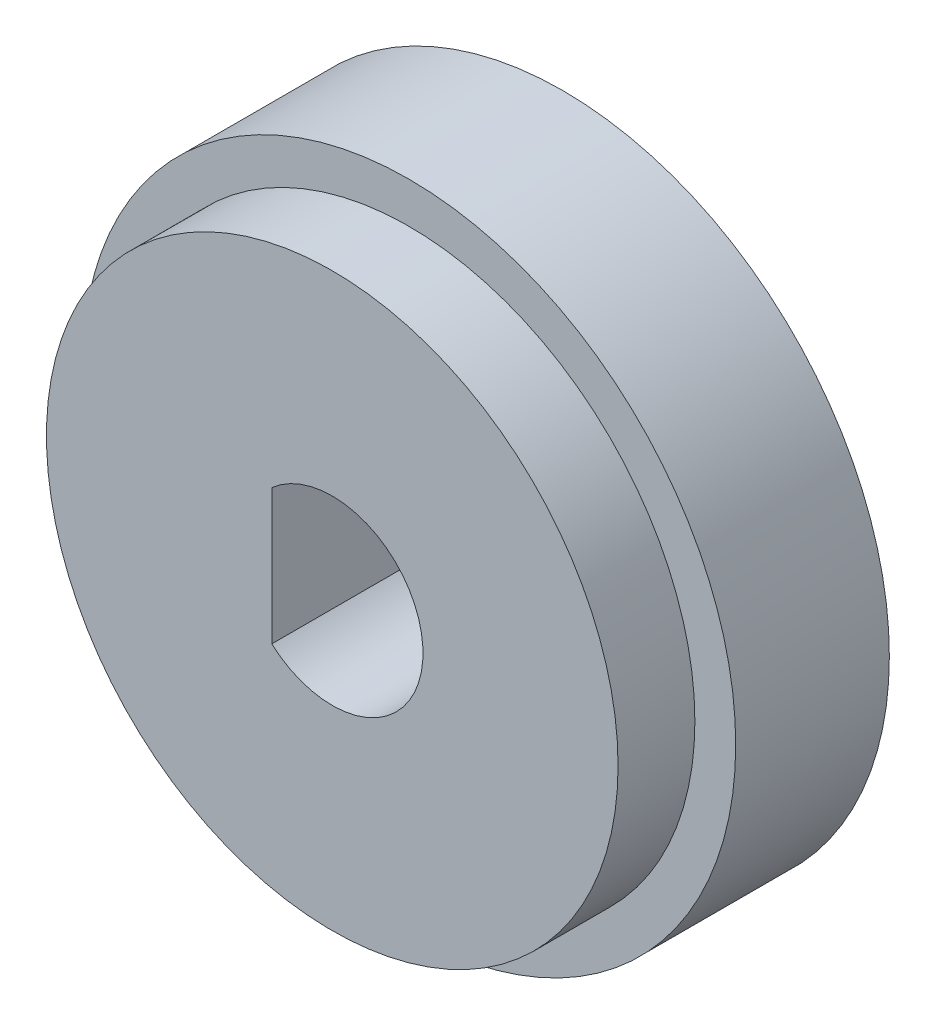
ISO-10303-21;
HEADER;
FILE_DESCRIPTION(('STEP AP214'),'2;1');
FILE_NAME('part.step','',(''),(''),'','','');
FILE_SCHEMA(('AUTOMOTIVE_DESIGN { 1 0 10303 214 1 1 1 1 }'));
ENDSEC;
DATA;
#1=APPLICATION_CONTEXT('core data for automotive mechanical design processes');
#2=APPLICATION_PROTOCOL_DEFINITION('international standard','automotive_design',2000,#1);
#3=PRODUCT_CONTEXT('',#1,'mechanical');
#4=PRODUCT('Part','Part','',(#3));
#5=PRODUCT_RELATED_PRODUCT_CATEGORY('part','',(#4));
#6=PRODUCT_DEFINITION_FORMATION('','',#4);
#7=PRODUCT_DEFINITION_CONTEXT('part definition',#1,'design');
#8=PRODUCT_DEFINITION('design','',#6,#7);
#9=PRODUCT_DEFINITION_SHAPE('','',#8);
#10=(LENGTH_UNIT() NAMED_UNIT(*) SI_UNIT(.MILLI.,.METRE.));
#11=(NAMED_UNIT(*) PLANE_ANGLE_UNIT() SI_UNIT($,.RADIAN.));
#12=(NAMED_UNIT(*) SI_UNIT($,.STERADIAN.) SOLID_ANGLE_UNIT());
#13=UNCERTAINTY_MEASURE_WITH_UNIT(LENGTH_MEASURE(1.E-05),#10,'distance_accuracy_value','');
#14=(GEOMETRIC_REPRESENTATION_CONTEXT(3) GLOBAL_UNCERTAINTY_ASSIGNED_CONTEXT((#13)) GLOBAL_UNIT_ASSIGNED_CONTEXT((#10,
#11,#12)) REPRESENTATION_CONTEXT('',''));
#15=CARTESIAN_POINT('',(0.,0.,0.));
#16=DIRECTION('',(0.,0.,1.));
#17=DIRECTION('',(1.,0.,0.));
#18=AXIS2_PLACEMENT_3D('',#15,#16,#17);
#19=CARTESIAN_POINT('',(0.,0.,5.08));
#20=DIRECTION('',(0.,0.,-1.));
#21=DIRECTION('',(-1.,0.,0.));
#22=AXIS2_PLACEMENT_3D('',#19,#20,#21);
#23=CYLINDRICAL_SURFACE('',#22,10.8);
#24=CARTESIAN_POINT('',(0.,0.,5.08));
#25=DIRECTION('',(0.,0.,1.));
#26=DIRECTION('',(1.,0.,0.));
#27=AXIS2_PLACEMENT_3D('',#24,#25,#26);
#28=CIRCLE('',#27,10.8);
#29=CARTESIAN_POINT('',(10.8,0.,5.08));
#30=VERTEX_POINT('',#29);
#31=EDGE_CURVE('E45',#30,#30,#28,.T.);
#32=ORIENTED_EDGE('',*,*,#31,.F.);
#33=EDGE_LOOP('',(#32));
#34=FACE_BOUND('',#33,.T.);
#35=CARTESIAN_POINT('',(0.,0.,0.));
#36=DIRECTION('',(0.,0.,1.));
#37=DIRECTION('',(1.,0.,0.));
#38=AXIS2_PLACEMENT_3D('',#35,#36,#37);
#39=CIRCLE('',#38,10.8);
#40=CARTESIAN_POINT('',(10.8,0.,0.));
#41=VERTEX_POINT('',#40);
#42=EDGE_CURVE('E40',#41,#41,#39,.T.);
#43=ORIENTED_EDGE('',*,*,#42,.T.);
#44=EDGE_LOOP('',(#43));
#45=FACE_BOUND('',#44,.T.);
#46=ADVANCED_FACE('F37',(#34,#45),#23,.T.);
#47=CARTESIAN_POINT('',(0.,0.,5.08));
#48=DIRECTION('',(0.,0.,1.));
#49=DIRECTION('',(1.,0.,0.));
#50=AXIS2_PLACEMENT_3D('',#47,#48,#49);
#51=PLANE('',#50);
#52=CARTESIAN_POINT('',(0.,0.,5.08));
#53=DIRECTION('',(0.,0.,1.));
#54=DIRECTION('',(1.,0.,0.));
#55=AXIS2_PLACEMENT_3D('',#52,#53,#54);
#56=CIRCLE('',#55,9.45);
#57=CARTESIAN_POINT('',(9.45,0.,5.08));
#58=VERTEX_POINT('',#57);
#59=EDGE_CURVE('E11',#58,#58,#56,.T.);
#60=ORIENTED_EDGE('',*,*,#59,.F.);
#61=EDGE_LOOP('',(#60));
#62=FACE_BOUND('',#61,.T.);
#63=ORIENTED_EDGE('',*,*,#31,.T.);
#64=EDGE_LOOP('',(#63));
#65=FACE_BOUND('',#64,.T.);
#66=ADVANCED_FACE('F96',(#62,#65),#51,.T.);
#67=CARTESIAN_POINT('',(0.,0.,0.));
#68=DIRECTION('',(0.,0.,1.));
#69=DIRECTION('',(1.,0.,0.));
#70=AXIS2_PLACEMENT_3D('',#67,#68,#69);
#71=PLANE('',#70);
#72=CARTESIAN_POINT('',(0.,0.,0.));
#73=DIRECTION('',(0.,0.,1.));
#74=DIRECTION('',(1.,0.,0.));
#75=AXIS2_PLACEMENT_3D('',#72,#73,#74);
#76=CIRCLE('',#75,3.);
#77=CARTESIAN_POINT('',(-2.,-2.23606797749979,0.));
#78=VERTEX_POINT('',#77);
#79=CARTESIAN_POINT('',(-2.,2.23606797749979,0.));
#80=VERTEX_POINT('',#79);
#81=EDGE_CURVE('E80',#78,#80,#76,.T.);
#82=ORIENTED_EDGE('',*,*,#81,.T.);
#83=DIRECTION('',(0.,-1.,0.));
#84=VECTOR('',#83,1.);
#85=CARTESIAN_POINT('',(-2.,0.,0.));
#86=LINE('',#85,#84);
#87=EDGE_CURVE('E69',#80,#78,#86,.T.);
#88=ORIENTED_EDGE('',*,*,#87,.T.);
#89=EDGE_LOOP('',(#82,#88));
#90=FACE_BOUND('',#89,.T.);
#91=ORIENTED_EDGE('',*,*,#42,.F.);
#92=EDGE_LOOP('',(#91));
#93=FACE_BOUND('',#92,.T.);
#94=ADVANCED_FACE('F93',(#90,#93),#71,.F.);
#95=CARTESIAN_POINT('',(0.,0.,7.62));
#96=DIRECTION('',(0.,0.,-1.));
#97=DIRECTION('',(-1.,0.,0.));
#98=AXIS2_PLACEMENT_3D('',#95,#96,#97);
#99=CYLINDRICAL_SURFACE('',#98,9.45);
#100=CARTESIAN_POINT('',(0.,0.,7.62));
#101=DIRECTION('',(0.,0.,1.));
#102=DIRECTION('',(1.,0.,0.));
#103=AXIS2_PLACEMENT_3D('',#100,#101,#102);
#104=CIRCLE('',#103,9.45);
#105=CARTESIAN_POINT('',(9.45,0.,7.62));
#106=VERTEX_POINT('',#105);
#107=EDGE_CURVE('E71',#106,#106,#104,.T.);
#108=ORIENTED_EDGE('',*,*,#107,.F.);
#109=EDGE_LOOP('',(#108));
#110=FACE_BOUND('',#109,.T.);
#111=ORIENTED_EDGE('',*,*,#59,.T.);
#112=EDGE_LOOP('',(#111));
#113=FACE_BOUND('',#112,.T.);
#114=ADVANCED_FACE('F95',(#110,#113),#99,.T.);
#115=CARTESIAN_POINT('',(0.,0.,7.62));
#116=DIRECTION('',(0.,0.,1.));
#117=DIRECTION('',(1.,0.,0.));
#118=AXIS2_PLACEMENT_3D('',#115,#116,#117);
#119=PLANE('',#118);
#120=DIRECTION('',(0.,-1.,0.));
#121=VECTOR('',#120,1.);
#122=CARTESIAN_POINT('',(-2.,0.,7.62));
#123=LINE('',#122,#121);
#124=CARTESIAN_POINT('',(-2.,2.23606797749979,7.62));
#125=VERTEX_POINT('',#124);
#126=CARTESIAN_POINT('',(-2.,-2.23606797749979,7.62));
#127=VERTEX_POINT('',#126);
#128=EDGE_CURVE('E66',#125,#127,#123,.T.);
#129=ORIENTED_EDGE('',*,*,#128,.F.);
#130=CARTESIAN_POINT('',(0.,0.,7.62));
#131=DIRECTION('',(0.,0.,1.));
#132=DIRECTION('',(1.,0.,0.));
#133=AXIS2_PLACEMENT_3D('',#130,#131,#132);
#134=CIRCLE('',#133,3.);
#135=EDGE_CURVE('E73',#127,#125,#134,.T.);
#136=ORIENTED_EDGE('',*,*,#135,.F.);
#137=EDGE_LOOP('',(#129,#136));
#138=FACE_BOUND('',#137,.T.);
#139=ORIENTED_EDGE('',*,*,#107,.T.);
#140=EDGE_LOOP('',(#139));
#141=FACE_BOUND('',#140,.T.);
#142=ADVANCED_FACE('F77',(#138,#141),#119,.T.);
#143=CARTESIAN_POINT('',(-2.,0.,0.));
#144=DIRECTION('',(-1.,0.,0.));
#145=DIRECTION('',(0.,0.,1.));
#146=AXIS2_PLACEMENT_3D('',#143,#144,#145);
#147=PLANE('',#146);
#148=ORIENTED_EDGE('',*,*,#128,.T.);
#149=DIRECTION('',(0.,0.,1.));
#150=VECTOR('',#149,1.);
#151=CARTESIAN_POINT('',(-2.,-2.23606797749979,0.));
#152=LINE('',#151,#150);
#153=EDGE_CURVE('E58',#78,#127,#152,.T.);
#154=ORIENTED_EDGE('',*,*,#153,.F.);
#155=ORIENTED_EDGE('',*,*,#87,.F.);
#156=DIRECTION('',(0.,0.,1.));
#157=VECTOR('',#156,1.);
#158=CARTESIAN_POINT('',(-2.,2.23606797749979,0.));
#159=LINE('',#158,#157);
#160=EDGE_CURVE('E53',#80,#125,#159,.T.);
#161=ORIENTED_EDGE('',*,*,#160,.T.);
#162=EDGE_LOOP('',(#148,#154,#155,#161));
#163=FACE_BOUND('',#162,.T.);
#164=ADVANCED_FACE('F64',(#163),#147,.F.);
#165=CARTESIAN_POINT('',(0.,0.,0.));
#166=DIRECTION('',(0.,0.,1.));
#167=DIRECTION('',(1.,0.,0.));
#168=AXIS2_PLACEMENT_3D('',#165,#166,#167);
#169=CYLINDRICAL_SURFACE('',#168,3.);
#170=ORIENTED_EDGE('',*,*,#135,.T.);
#171=ORIENTED_EDGE('',*,*,#160,.F.);
#172=ORIENTED_EDGE('',*,*,#81,.F.);
#173=ORIENTED_EDGE('',*,*,#153,.T.);
#174=EDGE_LOOP('',(#170,#171,#172,#173));
#175=FACE_BOUND('',#174,.T.);
#176=ADVANCED_FACE('F74',(#175),#169,.F.);
#177=CLOSED_SHELL('',(#46,#66,#94,#114,#142,#164,#176));
#178=MANIFOLD_SOLID_BREP('B2',#177);
#179=ADVANCED_BREP_SHAPE_REPRESENTATION('',(#18,#178),#14);
#180=SHAPE_DEFINITION_REPRESENTATION(#9,#179);
ENDSEC;
END-ISO-10303-21;
